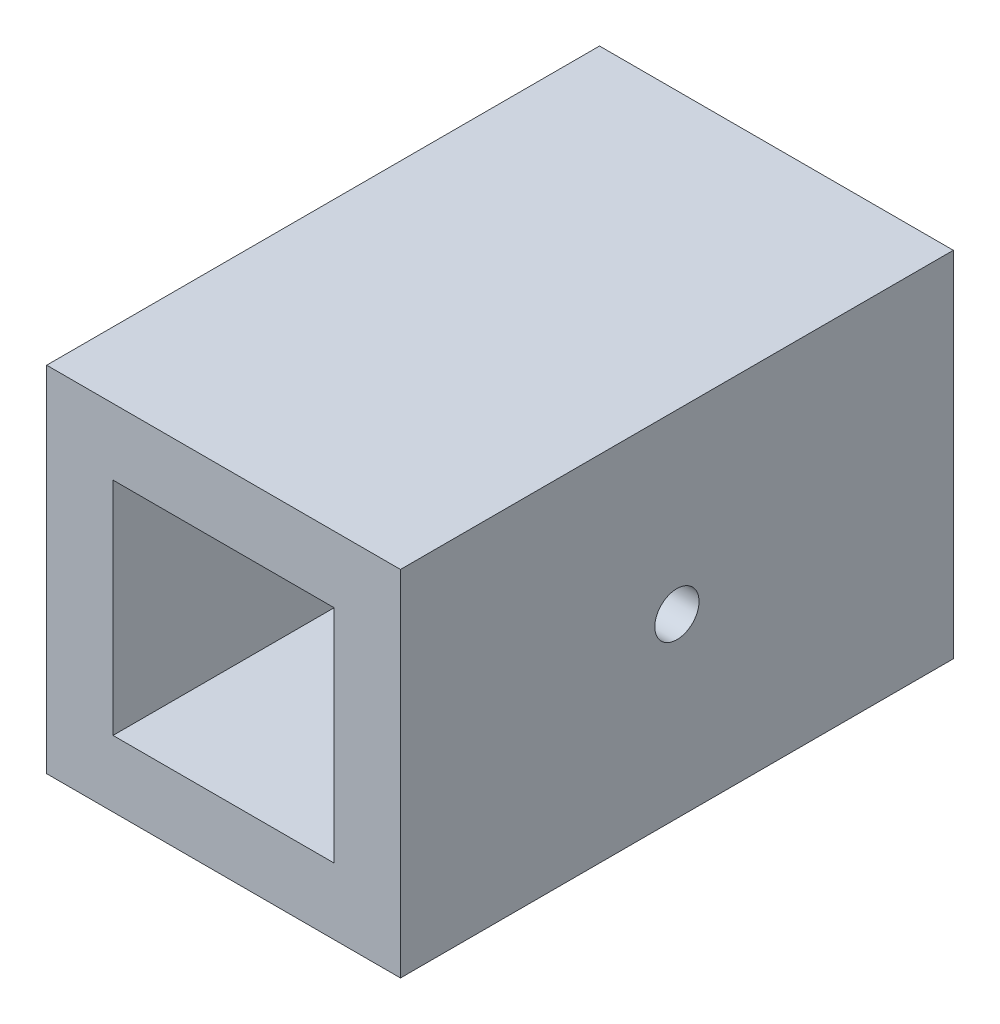
ISO-10303-21;
HEADER;
FILE_DESCRIPTION(('STEP AP214'),'2;1');
FILE_NAME('part.step','',(''),(''),'','','');
FILE_SCHEMA(('AUTOMOTIVE_DESIGN { 1 0 10303 214 1 1 1 1 }'));
ENDSEC;
DATA;
#1=APPLICATION_CONTEXT('core data for automotive mechanical design processes');
#2=APPLICATION_PROTOCOL_DEFINITION('international standard','automotive_design',2000,#1);
#3=PRODUCT_CONTEXT('',#1,'mechanical');
#4=PRODUCT('Part','Part','',(#3));
#5=PRODUCT_RELATED_PRODUCT_CATEGORY('part','',(#4));
#6=PRODUCT_DEFINITION_FORMATION('','',#4);
#7=PRODUCT_DEFINITION_CONTEXT('part definition',#1,'design');
#8=PRODUCT_DEFINITION('design','',#6,#7);
#9=PRODUCT_DEFINITION_SHAPE('','',#8);
#10=(LENGTH_UNIT() NAMED_UNIT(*) SI_UNIT(.MILLI.,.METRE.));
#11=(NAMED_UNIT(*) PLANE_ANGLE_UNIT() SI_UNIT($,.RADIAN.));
#12=(NAMED_UNIT(*) SI_UNIT($,.STERADIAN.) SOLID_ANGLE_UNIT());
#13=UNCERTAINTY_MEASURE_WITH_UNIT(LENGTH_MEASURE(1.E-05),#10,'distance_accuracy_value','');
#14=(GEOMETRIC_REPRESENTATION_CONTEXT(3) GLOBAL_UNCERTAINTY_ASSIGNED_CONTEXT((#13)) GLOBAL_UNIT_ASSIGNED_CONTEXT((#10,
#11,#12)) REPRESENTATION_CONTEXT('',''));
#15=CARTESIAN_POINT('',(0.,0.,0.));
#16=DIRECTION('',(0.,0.,1.));
#17=DIRECTION('',(1.,0.,0.));
#18=AXIS2_PLACEMENT_3D('',#15,#16,#17);
#19=CARTESIAN_POINT('',(0.,0.,0.));
#20=DIRECTION('',(0.,0.,-1.));
#21=DIRECTION('',(-1.,0.,0.));
#22=AXIS2_PLACEMENT_3D('',#19,#20,#21);
#23=PLANE('',#22);
#24=DIRECTION('',(0.,-1.,0.));
#25=VECTOR('',#24,1.);
#26=CARTESIAN_POINT('',(0.,0.,0.));
#27=LINE('',#26,#25);
#28=CARTESIAN_POINT('',(0.,16.,0.));
#29=VERTEX_POINT('',#28);
#30=CARTESIAN_POINT('',(0.,0.,0.));
#31=VERTEX_POINT('',#30);
#32=EDGE_CURVE('E240',#29,#31,#27,.T.);
#33=ORIENTED_EDGE('',*,*,#32,.F.);
#34=DIRECTION('',(-1.,0.,0.));
#35=VECTOR('',#34,1.);
#36=CARTESIAN_POINT('',(0.,16.,0.));
#37=LINE('',#36,#35);
#38=CARTESIAN_POINT('',(16.,16.,0.));
#39=VERTEX_POINT('',#38);
#40=EDGE_CURVE('E250',#39,#29,#37,.T.);
#41=ORIENTED_EDGE('',*,*,#40,.F.);
#42=DIRECTION('',(0.,1.,0.));
#43=VECTOR('',#42,1.);
#44=CARTESIAN_POINT('',(16.,0.,0.));
#45=LINE('',#44,#43);
#46=CARTESIAN_POINT('',(16.,0.,0.));
#47=VERTEX_POINT('',#46);
#48=EDGE_CURVE('E247',#47,#39,#45,.T.);
#49=ORIENTED_EDGE('',*,*,#48,.F.);
#50=DIRECTION('',(1.,0.,0.));
#51=VECTOR('',#50,1.);
#52=CARTESIAN_POINT('',(0.,0.,0.));
#53=LINE('',#52,#51);
#54=EDGE_CURVE('E244',#31,#47,#53,.T.);
#55=ORIENTED_EDGE('',*,*,#54,.F.);
#56=EDGE_LOOP('',(#33,#41,#49,#55));
#57=FACE_BOUND('',#56,.T.);
#58=DIRECTION('',(-1.,0.,0.));
#59=VECTOR('',#58,1.);
#60=CARTESIAN_POINT('',(3.,13.,0.));
#61=LINE('',#60,#59);
#62=CARTESIAN_POINT('',(13.,13.,0.));
#63=VERTEX_POINT('',#62);
#64=CARTESIAN_POINT('',(3.,13.,0.));
#65=VERTEX_POINT('',#64);
#66=EDGE_CURVE('E200',#63,#65,#61,.T.);
#67=ORIENTED_EDGE('',*,*,#66,.T.);
#68=DIRECTION('',(0.,-1.,0.));
#69=VECTOR('',#68,1.);
#70=CARTESIAN_POINT('',(3.,3.,0.));
#71=LINE('',#70,#69);
#72=CARTESIAN_POINT('',(3.,3.,0.));
#73=VERTEX_POINT('',#72);
#74=EDGE_CURVE('E194',#65,#73,#71,.T.);
#75=ORIENTED_EDGE('',*,*,#74,.T.);
#76=DIRECTION('',(1.,0.,0.));
#77=VECTOR('',#76,1.);
#78=CARTESIAN_POINT('',(3.,3.,0.));
#79=LINE('',#78,#77);
#80=CARTESIAN_POINT('',(13.,3.,0.));
#81=VERTEX_POINT('',#80);
#82=EDGE_CURVE('E216',#73,#81,#79,.T.);
#83=ORIENTED_EDGE('',*,*,#82,.T.);
#84=DIRECTION('',(0.,1.,0.));
#85=VECTOR('',#84,1.);
#86=CARTESIAN_POINT('',(13.,3.,0.));
#87=LINE('',#86,#85);
#88=EDGE_CURVE('E220',#81,#63,#87,.T.);
#89=ORIENTED_EDGE('',*,*,#88,.T.);
#90=EDGE_LOOP('',(#67,#75,#83,#89));
#91=FACE_BOUND('',#90,.T.);
#92=ADVANCED_FACE('F39',(#57,#91),#23,.T.);
#93=CARTESIAN_POINT('',(0.,0.,10.));
#94=DIRECTION('',(1.,0.,0.));
#95=DIRECTION('',(0.,0.,-1.));
#96=AXIS2_PLACEMENT_3D('',#93,#94,#95);
#97=PLANE('',#96);
#98=CARTESIAN_POINT('',(0.,8.,12.5));
#99=DIRECTION('',(1.,0.,0.));
#100=DIRECTION('',(0.,0.,-1.));
#101=AXIS2_PLACEMENT_3D('',#98,#99,#100);
#102=CIRCLE('',#101,1.);
#103=CARTESIAN_POINT('',(0.,8.,11.5));
#104=VERTEX_POINT('',#103);
#105=EDGE_CURVE('E163',#104,#104,#102,.T.);
#106=ORIENTED_EDGE('',*,*,#105,.T.);
#107=EDGE_LOOP('',(#106));
#108=FACE_BOUND('',#107,.T.);
#109=ORIENTED_EDGE('',*,*,#32,.T.);
#110=DIRECTION('',(0.,0.,-1.));
#111=VECTOR('',#110,1.);
#112=CARTESIAN_POINT('',(0.,0.,10.));
#113=LINE('',#112,#111);
#114=CARTESIAN_POINT('',(0.,0.,25.));
#115=VERTEX_POINT('',#114);
#116=EDGE_CURVE('E11',#115,#31,#113,.T.);
#117=ORIENTED_EDGE('',*,*,#116,.F.);
#118=DIRECTION('',(0.,-1.,0.));
#119=VECTOR('',#118,1.);
#120=CARTESIAN_POINT('',(0.,16.,25.));
#121=LINE('',#120,#119);
#122=CARTESIAN_POINT('',(0.,16.,25.));
#123=VERTEX_POINT('',#122);
#124=EDGE_CURVE('E145',#123,#115,#121,.T.);
#125=ORIENTED_EDGE('',*,*,#124,.F.);
#126=DIRECTION('',(0.,0.,-1.));
#127=VECTOR('',#126,1.);
#128=CARTESIAN_POINT('',(0.,16.,10.));
#129=LINE('',#128,#127);
#130=EDGE_CURVE('E253',#123,#29,#129,.T.);
#131=ORIENTED_EDGE('',*,*,#130,.T.);
#132=EDGE_LOOP('',(#109,#117,#125,#131));
#133=FACE_BOUND('',#132,.T.);
#134=ADVANCED_FACE('F41',(#108,#133),#97,.F.);
#135=CARTESIAN_POINT('',(0.,0.,10.));
#136=DIRECTION('',(0.,1.,0.));
#137=DIRECTION('',(0.,0.,1.));
#138=AXIS2_PLACEMENT_3D('',#135,#136,#137);
#139=PLANE('',#138);
#140=ORIENTED_EDGE('',*,*,#54,.T.);
#141=DIRECTION('',(0.,0.,-1.));
#142=VECTOR('',#141,1.);
#143=CARTESIAN_POINT('',(16.,0.,10.));
#144=LINE('',#143,#142);
#145=CARTESIAN_POINT('',(16.,0.,25.));
#146=VERTEX_POINT('',#145);
#147=EDGE_CURVE('E48',#146,#47,#144,.T.);
#148=ORIENTED_EDGE('',*,*,#147,.F.);
#149=DIRECTION('',(1.,0.,0.));
#150=VECTOR('',#149,1.);
#151=CARTESIAN_POINT('',(0.,0.,25.));
#152=LINE('',#151,#150);
#153=EDGE_CURVE('E182',#115,#146,#152,.T.);
#154=ORIENTED_EDGE('',*,*,#153,.F.);
#155=ORIENTED_EDGE('',*,*,#116,.T.);
#156=EDGE_LOOP('',(#140,#148,#154,#155));
#157=FACE_BOUND('',#156,.T.);
#158=ADVANCED_FACE('F278',(#157),#139,.F.);
#159=CARTESIAN_POINT('',(16.,0.,10.));
#160=DIRECTION('',(-1.,0.,0.));
#161=DIRECTION('',(0.,0.,1.));
#162=AXIS2_PLACEMENT_3D('',#159,#160,#161);
#163=PLANE('',#162);
#164=CARTESIAN_POINT('',(16.,8.,12.5));
#165=DIRECTION('',(1.,0.,0.));
#166=DIRECTION('',(0.,0.,-1.));
#167=AXIS2_PLACEMENT_3D('',#164,#165,#166);
#168=CIRCLE('',#167,1.);
#169=CARTESIAN_POINT('',(16.,8.,11.5));
#170=VERTEX_POINT('',#169);
#171=EDGE_CURVE('E433',#170,#170,#168,.T.);
#172=ORIENTED_EDGE('',*,*,#171,.F.);
#173=EDGE_LOOP('',(#172));
#174=FACE_BOUND('',#173,.T.);
#175=ORIENTED_EDGE('',*,*,#48,.T.);
#176=DIRECTION('',(0.,0.,-1.));
#177=VECTOR('',#176,1.);
#178=CARTESIAN_POINT('',(16.,16.,10.));
#179=LINE('',#178,#177);
#180=CARTESIAN_POINT('',(16.,16.,25.));
#181=VERTEX_POINT('',#180);
#182=EDGE_CURVE('E257',#181,#39,#179,.T.);
#183=ORIENTED_EDGE('',*,*,#182,.F.);
#184=DIRECTION('',(0.,1.,0.));
#185=VECTOR('',#184,1.);
#186=CARTESIAN_POINT('',(16.,16.,25.));
#187=LINE('',#186,#185);
#188=EDGE_CURVE('E186',#146,#181,#187,.T.);
#189=ORIENTED_EDGE('',*,*,#188,.F.);
#190=ORIENTED_EDGE('',*,*,#147,.T.);
#191=EDGE_LOOP('',(#175,#183,#189,#190));
#192=FACE_BOUND('',#191,.T.);
#193=ADVANCED_FACE('F265',(#174,#192),#163,.F.);
#194=CARTESIAN_POINT('',(0.,16.,10.));
#195=DIRECTION('',(0.,-1.,0.));
#196=DIRECTION('',(0.,0.,-1.));
#197=AXIS2_PLACEMENT_3D('',#194,#195,#196);
#198=PLANE('',#197);
#199=ORIENTED_EDGE('',*,*,#40,.T.);
#200=ORIENTED_EDGE('',*,*,#130,.F.);
#201=DIRECTION('',(-1.,0.,0.));
#202=VECTOR('',#201,1.);
#203=CARTESIAN_POINT('',(0.,16.,25.));
#204=LINE('',#203,#202);
#205=EDGE_CURVE('E190',#181,#123,#204,.T.);
#206=ORIENTED_EDGE('',*,*,#205,.F.);
#207=ORIENTED_EDGE('',*,*,#182,.T.);
#208=EDGE_LOOP('',(#199,#200,#206,#207));
#209=FACE_BOUND('',#208,.T.);
#210=ADVANCED_FACE('F273',(#209),#198,.F.);
#211=CARTESIAN_POINT('',(3.,3.,10.));
#212=DIRECTION('',(1.,0.,0.));
#213=DIRECTION('',(0.,0.,-1.));
#214=AXIS2_PLACEMENT_3D('',#211,#212,#213);
#215=PLANE('',#214);
#216=ORIENTED_EDGE('',*,*,#74,.F.);
#217=DIRECTION('',(0.,0.,-1.));
#218=VECTOR('',#217,1.);
#219=CARTESIAN_POINT('',(3.,13.,10.));
#220=LINE('',#219,#218);
#221=CARTESIAN_POINT('',(3.,13.,10.));
#222=VERTEX_POINT('',#221);
#223=EDGE_CURVE('E212',#222,#65,#220,.T.);
#224=ORIENTED_EDGE('',*,*,#223,.F.);
#225=DIRECTION('',(0.,-1.,0.));
#226=VECTOR('',#225,1.);
#227=CARTESIAN_POINT('',(3.,3.,10.));
#228=LINE('',#227,#226);
#229=CARTESIAN_POINT('',(3.,3.,10.));
#230=VERTEX_POINT('',#229);
#231=EDGE_CURVE('E195',#222,#230,#228,.T.);
#232=ORIENTED_EDGE('',*,*,#231,.T.);
#233=DIRECTION('',(0.,0.,-1.));
#234=VECTOR('',#233,1.);
#235=CARTESIAN_POINT('',(3.,3.,10.));
#236=LINE('',#235,#234);
#237=EDGE_CURVE('E236',#230,#73,#236,.T.);
#238=ORIENTED_EDGE('',*,*,#237,.T.);
#239=EDGE_LOOP('',(#216,#224,#232,#238));
#240=FACE_BOUND('',#239,.T.);
#241=ADVANCED_FACE('F293',(#240),#215,.T.);
#242=CARTESIAN_POINT('',(3.,3.,10.));
#243=DIRECTION('',(0.,1.,0.));
#244=DIRECTION('',(0.,0.,1.));
#245=AXIS2_PLACEMENT_3D('',#242,#243,#244);
#246=PLANE('',#245);
#247=ORIENTED_EDGE('',*,*,#82,.F.);
#248=ORIENTED_EDGE('',*,*,#237,.F.);
#249=DIRECTION('',(1.,0.,0.));
#250=VECTOR('',#249,1.);
#251=CARTESIAN_POINT('',(3.,3.,10.));
#252=LINE('',#251,#250);
#253=CARTESIAN_POINT('',(13.,3.,10.));
#254=VERTEX_POINT('',#253);
#255=EDGE_CURVE('E199',#230,#254,#252,.T.);
#256=ORIENTED_EDGE('',*,*,#255,.T.);
#257=DIRECTION('',(0.,0.,-1.));
#258=VECTOR('',#257,1.);
#259=CARTESIAN_POINT('',(13.,3.,10.));
#260=LINE('',#259,#258);
#261=EDGE_CURVE('E233',#254,#81,#260,.T.);
#262=ORIENTED_EDGE('',*,*,#261,.T.);
#263=EDGE_LOOP('',(#247,#248,#256,#262));
#264=FACE_BOUND('',#263,.T.);
#265=ADVANCED_FACE('F299',(#264),#246,.T.);
#266=CARTESIAN_POINT('',(13.,3.,10.));
#267=DIRECTION('',(-1.,0.,0.));
#268=DIRECTION('',(0.,-1.,0.));
#269=AXIS2_PLACEMENT_3D('',#266,#267,#268);
#270=PLANE('',#269);
#271=ORIENTED_EDGE('',*,*,#88,.F.);
#272=ORIENTED_EDGE('',*,*,#261,.F.);
#273=DIRECTION('',(0.,1.,0.));
#274=VECTOR('',#273,1.);
#275=CARTESIAN_POINT('',(13.,3.,10.));
#276=LINE('',#275,#274);
#277=CARTESIAN_POINT('',(13.,13.,10.));
#278=VERTEX_POINT('',#277);
#279=EDGE_CURVE('E204',#254,#278,#276,.T.);
#280=ORIENTED_EDGE('',*,*,#279,.T.);
#281=DIRECTION('',(0.,0.,-1.));
#282=VECTOR('',#281,1.);
#283=CARTESIAN_POINT('',(13.,13.,10.));
#284=LINE('',#283,#282);
#285=EDGE_CURVE('E230',#278,#63,#284,.T.);
#286=ORIENTED_EDGE('',*,*,#285,.T.);
#287=EDGE_LOOP('',(#271,#272,#280,#286));
#288=FACE_BOUND('',#287,.T.);
#289=ADVANCED_FACE('F304',(#288),#270,.T.);
#290=CARTESIAN_POINT('',(3.,13.,10.));
#291=DIRECTION('',(0.,-1.,0.));
#292=DIRECTION('',(0.,0.,-1.));
#293=AXIS2_PLACEMENT_3D('',#290,#291,#292);
#294=PLANE('',#293);
#295=ORIENTED_EDGE('',*,*,#66,.F.);
#296=ORIENTED_EDGE('',*,*,#285,.F.);
#297=DIRECTION('',(-1.,0.,0.));
#298=VECTOR('',#297,1.);
#299=CARTESIAN_POINT('',(3.,13.,10.));
#300=LINE('',#299,#298);
#301=EDGE_CURVE('E208',#278,#222,#300,.T.);
#302=ORIENTED_EDGE('',*,*,#301,.T.);
#303=ORIENTED_EDGE('',*,*,#223,.T.);
#304=EDGE_LOOP('',(#295,#296,#302,#303));
#305=FACE_BOUND('',#304,.T.);
#306=ADVANCED_FACE('F310',(#305),#294,.T.);
#307=CARTESIAN_POINT('',(0.,0.,10.));
#308=DIRECTION('',(0.,0.,1.));
#309=DIRECTION('',(1.,0.,0.));
#310=AXIS2_PLACEMENT_3D('',#307,#308,#309);
#311=PLANE('',#310);
#312=ORIENTED_EDGE('',*,*,#231,.F.);
#313=ORIENTED_EDGE('',*,*,#301,.F.);
#314=ORIENTED_EDGE('',*,*,#279,.F.);
#315=ORIENTED_EDGE('',*,*,#255,.F.);
#316=EDGE_LOOP('',(#312,#313,#314,#315));
#317=FACE_BOUND('',#316,.T.);
#318=ADVANCED_FACE('F316',(#317),#311,.F.);
#319=CARTESIAN_POINT('',(0.,0.,25.));
#320=DIRECTION('',(0.,0.,1.));
#321=DIRECTION('',(1.,0.,0.));
#322=AXIS2_PLACEMENT_3D('',#319,#320,#321);
#323=PLANE('',#322);
#324=ORIENTED_EDGE('',*,*,#124,.T.);
#325=ORIENTED_EDGE('',*,*,#153,.T.);
#326=ORIENTED_EDGE('',*,*,#188,.T.);
#327=ORIENTED_EDGE('',*,*,#205,.T.);
#328=EDGE_LOOP('',(#324,#325,#326,#327));
#329=FACE_BOUND('',#328,.T.);
#330=DIRECTION('',(1.,0.,0.));
#331=VECTOR('',#330,1.);
#332=CARTESIAN_POINT('',(3.,3.,25.));
#333=LINE('',#332,#331);
#334=CARTESIAN_POINT('',(3.,3.,25.));
#335=VERTEX_POINT('',#334);
#336=CARTESIAN_POINT('',(13.,3.,25.));
#337=VERTEX_POINT('',#336);
#338=EDGE_CURVE('E138',#335,#337,#333,.T.);
#339=ORIENTED_EDGE('',*,*,#338,.F.);
#340=DIRECTION('',(0.,-1.,0.));
#341=VECTOR('',#340,1.);
#342=CARTESIAN_POINT('',(3.,13.,25.));
#343=LINE('',#342,#341);
#344=CARTESIAN_POINT('',(3.,13.,25.));
#345=VERTEX_POINT('',#344);
#346=EDGE_CURVE('E128',#345,#335,#343,.T.);
#347=ORIENTED_EDGE('',*,*,#346,.F.);
#348=DIRECTION('',(-1.,0.,0.));
#349=VECTOR('',#348,1.);
#350=CARTESIAN_POINT('',(3.,13.,25.));
#351=LINE('',#350,#349);
#352=CARTESIAN_POINT('',(13.,13.,25.));
#353=VERTEX_POINT('',#352);
#354=EDGE_CURVE('E155',#353,#345,#351,.T.);
#355=ORIENTED_EDGE('',*,*,#354,.F.);
#356=DIRECTION('',(0.,1.,0.));
#357=VECTOR('',#356,1.);
#358=CARTESIAN_POINT('',(13.,13.,25.));
#359=LINE('',#358,#357);
#360=EDGE_CURVE('E151',#337,#353,#359,.T.);
#361=ORIENTED_EDGE('',*,*,#360,.F.);
#362=EDGE_LOOP('',(#339,#347,#355,#361));
#363=FACE_BOUND('',#362,.T.);
#364=ADVANCED_FACE('F149',(#329,#363),#323,.T.);
#365=CARTESIAN_POINT('',(3.,13.,25.));
#366=DIRECTION('',(1.,0.,0.));
#367=DIRECTION('',(0.,1.,0.));
#368=AXIS2_PLACEMENT_3D('',#365,#366,#367);
#369=PLANE('',#368);
#370=DIRECTION('',(0.,-1.,0.));
#371=VECTOR('',#370,1.);
#372=CARTESIAN_POINT('',(3.,13.,15.));
#373=LINE('',#372,#371);
#374=CARTESIAN_POINT('',(3.,13.,15.));
#375=VERTEX_POINT('',#374);
#376=CARTESIAN_POINT('',(3.,3.,15.));
#377=VERTEX_POINT('',#376);
#378=EDGE_CURVE('E55',#375,#377,#373,.T.);
#379=ORIENTED_EDGE('',*,*,#378,.F.);
#380=DIRECTION('',(0.,0.,-1.));
#381=VECTOR('',#380,1.);
#382=CARTESIAN_POINT('',(3.,13.,25.));
#383=LINE('',#382,#381);
#384=EDGE_CURVE('E133',#345,#375,#383,.T.);
#385=ORIENTED_EDGE('',*,*,#384,.F.);
#386=ORIENTED_EDGE('',*,*,#346,.T.);
#387=DIRECTION('',(0.,0.,-1.));
#388=VECTOR('',#387,1.);
#389=CARTESIAN_POINT('',(3.,3.,25.));
#390=LINE('',#389,#388);
#391=EDGE_CURVE('E131',#335,#377,#390,.T.);
#392=ORIENTED_EDGE('',*,*,#391,.T.);
#393=EDGE_LOOP('',(#379,#385,#386,#392));
#394=FACE_BOUND('',#393,.T.);
#395=ADVANCED_FACE('F130',(#394),#369,.T.);
#396=CARTESIAN_POINT('',(3.,3.,25.));
#397=DIRECTION('',(0.,1.,0.));
#398=DIRECTION('',(0.,0.,1.));
#399=AXIS2_PLACEMENT_3D('',#396,#397,#398);
#400=PLANE('',#399);
#401=DIRECTION('',(1.,0.,0.));
#402=VECTOR('',#401,1.);
#403=CARTESIAN_POINT('',(3.,3.,15.));
#404=LINE('',#403,#402);
#405=CARTESIAN_POINT('',(13.,3.,15.));
#406=VERTEX_POINT('',#405);
#407=EDGE_CURVE('E59',#377,#406,#404,.T.);
#408=ORIENTED_EDGE('',*,*,#407,.F.);
#409=ORIENTED_EDGE('',*,*,#391,.F.);
#410=ORIENTED_EDGE('',*,*,#338,.T.);
#411=DIRECTION('',(0.,0.,-1.));
#412=VECTOR('',#411,1.);
#413=CARTESIAN_POINT('',(13.,3.,25.));
#414=LINE('',#413,#412);
#415=EDGE_CURVE('E146',#337,#406,#414,.T.);
#416=ORIENTED_EDGE('',*,*,#415,.T.);
#417=EDGE_LOOP('',(#408,#409,#410,#416));
#418=FACE_BOUND('',#417,.T.);
#419=ADVANCED_FACE('F142',(#418),#400,.T.);
#420=CARTESIAN_POINT('',(13.,13.,25.));
#421=DIRECTION('',(-1.,0.,0.));
#422=DIRECTION('',(0.,-1.,0.));
#423=AXIS2_PLACEMENT_3D('',#420,#421,#422);
#424=PLANE('',#423);
#425=DIRECTION('',(0.,1.,0.));
#426=VECTOR('',#425,1.);
#427=CARTESIAN_POINT('',(13.,13.,15.));
#428=LINE('',#427,#426);
#429=CARTESIAN_POINT('',(13.,13.,15.));
#430=VERTEX_POINT('',#429);
#431=EDGE_CURVE('E166',#406,#430,#428,.T.);
#432=ORIENTED_EDGE('',*,*,#431,.F.);
#433=ORIENTED_EDGE('',*,*,#415,.F.);
#434=ORIENTED_EDGE('',*,*,#360,.T.);
#435=DIRECTION('',(0.,0.,-1.));
#436=VECTOR('',#435,1.);
#437=CARTESIAN_POINT('',(13.,13.,25.));
#438=LINE('',#437,#436);
#439=EDGE_CURVE('E173',#353,#430,#438,.T.);
#440=ORIENTED_EDGE('',*,*,#439,.T.);
#441=EDGE_LOOP('',(#432,#433,#434,#440));
#442=FACE_BOUND('',#441,.T.);
#443=ADVANCED_FACE('F378',(#442),#424,.T.);
#444=CARTESIAN_POINT('',(3.,13.,25.));
#445=DIRECTION('',(0.,-1.,0.));
#446=DIRECTION('',(0.,0.,-1.));
#447=AXIS2_PLACEMENT_3D('',#444,#445,#446);
#448=PLANE('',#447);
#449=DIRECTION('',(-1.,0.,0.));
#450=VECTOR('',#449,1.);
#451=CARTESIAN_POINT('',(3.,13.,15.));
#452=LINE('',#451,#450);
#453=EDGE_CURVE('E139',#430,#375,#452,.T.);
#454=ORIENTED_EDGE('',*,*,#453,.F.);
#455=ORIENTED_EDGE('',*,*,#439,.F.);
#456=ORIENTED_EDGE('',*,*,#354,.T.);
#457=ORIENTED_EDGE('',*,*,#384,.T.);
#458=EDGE_LOOP('',(#454,#455,#456,#457));
#459=FACE_BOUND('',#458,.T.);
#460=ADVANCED_FACE('F387',(#459),#448,.T.);
#461=CARTESIAN_POINT('',(0.,0.,15.));
#462=DIRECTION('',(0.,0.,1.));
#463=DIRECTION('',(1.,0.,0.));
#464=AXIS2_PLACEMENT_3D('',#461,#462,#463);
#465=PLANE('',#464);
#466=ORIENTED_EDGE('',*,*,#378,.T.);
#467=ORIENTED_EDGE('',*,*,#407,.T.);
#468=ORIENTED_EDGE('',*,*,#431,.T.);
#469=ORIENTED_EDGE('',*,*,#453,.T.);
#470=EDGE_LOOP('',(#466,#467,#468,#469));
#471=FACE_BOUND('',#470,.T.);
#472=ADVANCED_FACE('F326',(#471),#465,.T.);
#473=CARTESIAN_POINT('',(0.,8.,12.5));
#474=DIRECTION('',(1.,0.,0.));
#475=DIRECTION('',(0.,0.,-1.));
#476=AXIS2_PLACEMENT_3D('',#473,#474,#475);
#477=CYLINDRICAL_SURFACE('',#476,1.);
#478=ORIENTED_EDGE('',*,*,#105,.F.);
#479=EDGE_LOOP('',(#478));
#480=FACE_BOUND('',#479,.T.);
#481=ORIENTED_EDGE('',*,*,#171,.T.);
#482=EDGE_LOOP('',(#481));
#483=FACE_BOUND('',#482,.T.);
#484=ADVANCED_FACE('F406',(#480,#483),#477,.F.);
#485=CLOSED_SHELL('',(#92,#134,#158,#193,#210,#241,#265,#289,#306,#318,#364,#395,#419,#443,#460,
#472,#484));
#486=MANIFOLD_SOLID_BREP('B2',#485);
#487=ADVANCED_BREP_SHAPE_REPRESENTATION('',(#18,#486),#14);
#488=SHAPE_DEFINITION_REPRESENTATION(#9,#487);
ENDSEC;
END-ISO-10303-21;
